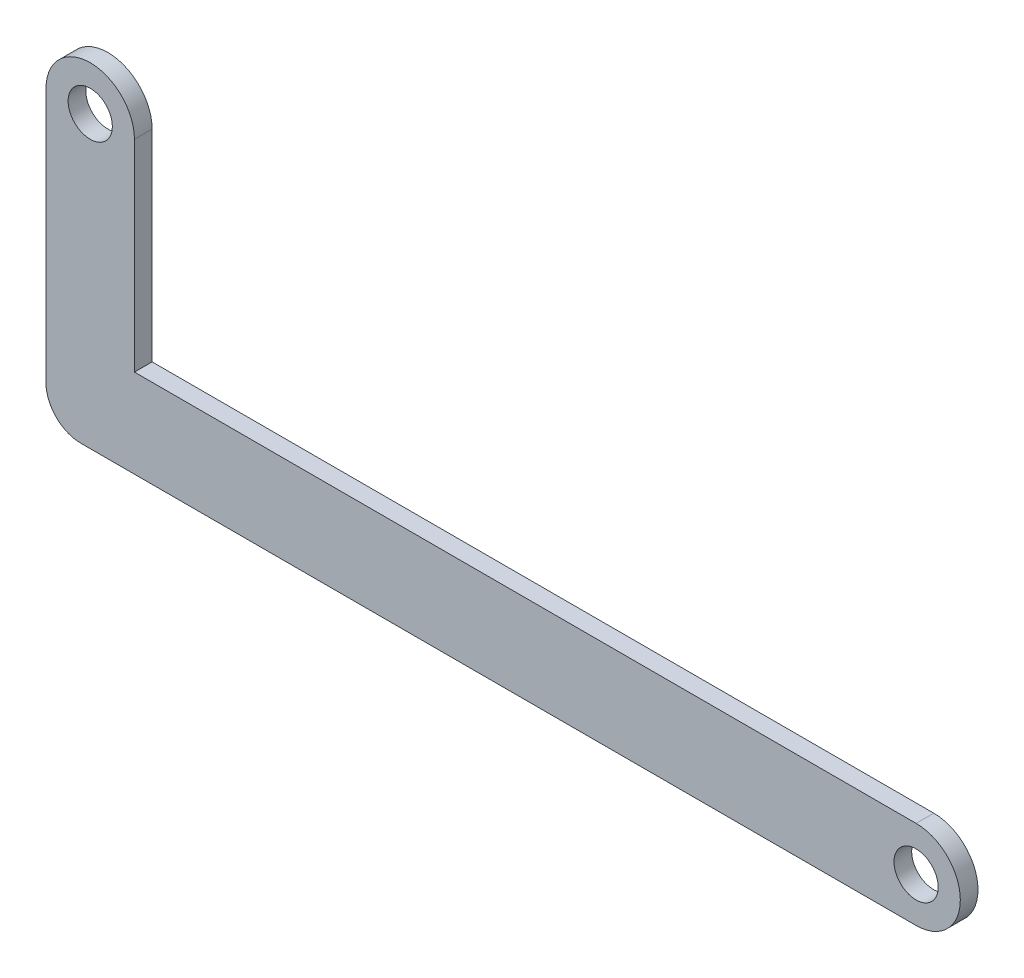
ISO-10303-21;
HEADER;
FILE_DESCRIPTION(('STEP AP214'),'2;1');
FILE_NAME('part.step','',(''),(''),'','','');
FILE_SCHEMA(('AUTOMOTIVE_DESIGN { 1 0 10303 214 1 1 1 1 }'));
ENDSEC;
DATA;
#1=APPLICATION_CONTEXT('core data for automotive mechanical design processes');
#2=APPLICATION_PROTOCOL_DEFINITION('international standard','automotive_design',2000,#1);
#3=PRODUCT_CONTEXT('',#1,'mechanical');
#4=PRODUCT('Part','Part','',(#3));
#5=PRODUCT_RELATED_PRODUCT_CATEGORY('part','',(#4));
#6=PRODUCT_DEFINITION_FORMATION('','',#4);
#7=PRODUCT_DEFINITION_CONTEXT('part definition',#1,'design');
#8=PRODUCT_DEFINITION('design','',#6,#7);
#9=PRODUCT_DEFINITION_SHAPE('','',#8);
#10=(LENGTH_UNIT() NAMED_UNIT(*) SI_UNIT(.MILLI.,.METRE.));
#11=(NAMED_UNIT(*) PLANE_ANGLE_UNIT() SI_UNIT($,.RADIAN.));
#12=(NAMED_UNIT(*) SI_UNIT($,.STERADIAN.) SOLID_ANGLE_UNIT());
#13=UNCERTAINTY_MEASURE_WITH_UNIT(LENGTH_MEASURE(1.E-05),#10,'distance_accuracy_value','');
#14=(GEOMETRIC_REPRESENTATION_CONTEXT(3) GLOBAL_UNCERTAINTY_ASSIGNED_CONTEXT((#13)) GLOBAL_UNIT_ASSIGNED_CONTEXT((#10,
#11,#12)) REPRESENTATION_CONTEXT('',''));
#15=CARTESIAN_POINT('',(0.,0.,0.));
#16=DIRECTION('',(0.,0.,1.));
#17=DIRECTION('',(1.,0.,0.));
#18=AXIS2_PLACEMENT_3D('',#15,#16,#17);
#19=CARTESIAN_POINT('',(0.,0.,-5.08));
#20=DIRECTION('',(0.,0.,1.));
#21=DIRECTION('',(1.,0.,0.));
#22=AXIS2_PLACEMENT_3D('',#19,#20,#21);
#23=PLANE('',#22);
#24=CARTESIAN_POINT('',(0.,0.,-5.08));
#25=DIRECTION('',(0.,0.,-1.));
#26=DIRECTION('',(1.,0.,0.));
#27=AXIS2_PLACEMENT_3D('',#24,#25,#26);
#28=CIRCLE('',#27,12.7);
#29=CARTESIAN_POINT('',(0.,12.7,-5.08));
#30=VERTEX_POINT('',#29);
#31=CARTESIAN_POINT('',(0.,-12.7,-5.08));
#32=VERTEX_POINT('',#31);
#33=EDGE_CURVE('E147',#30,#32,#28,.T.);
#34=ORIENTED_EDGE('',*,*,#33,.T.);
#35=DIRECTION('',(-1.,0.,0.));
#36=VECTOR('',#35,1.);
#37=CARTESIAN_POINT('',(0.,-12.7,-5.08));
#38=LINE('',#37,#36);
#39=CARTESIAN_POINT('',(-239.9,-12.7,-5.08));
#40=VERTEX_POINT('',#39);
#41=EDGE_CURVE('E100',#32,#40,#38,.T.);
#42=ORIENTED_EDGE('',*,*,#41,.T.);
#43=CARTESIAN_POINT('',(-239.9,-2.7,-5.08));
#44=DIRECTION('',(0.,0.,-1.));
#45=DIRECTION('',(-1.,0.,0.));
#46=AXIS2_PLACEMENT_3D('',#43,#44,#45);
#47=CIRCLE('',#46,10.);
#48=CARTESIAN_POINT('',(-249.9,-2.7,-5.08));
#49=VERTEX_POINT('',#48);
#50=EDGE_CURVE('E159',#40,#49,#47,.T.);
#51=ORIENTED_EDGE('',*,*,#50,.T.);
#52=DIRECTION('',(0.,1.,0.));
#53=VECTOR('',#52,1.);
#54=CARTESIAN_POINT('',(-249.9,70.6,-5.08));
#55=LINE('',#54,#53);
#56=CARTESIAN_POINT('',(-249.9,70.6,-5.08));
#57=VERTEX_POINT('',#56);
#58=EDGE_CURVE('E116',#49,#57,#55,.T.);
#59=ORIENTED_EDGE('',*,*,#58,.T.);
#60=CARTESIAN_POINT('',(-237.2,70.6,-5.08));
#61=DIRECTION('',(0.,0.,-1.));
#62=DIRECTION('',(-1.,0.,0.));
#63=AXIS2_PLACEMENT_3D('',#60,#61,#62);
#64=CIRCLE('',#63,12.7);
#65=CARTESIAN_POINT('',(-224.5,70.6,-5.08));
#66=VERTEX_POINT('',#65);
#67=EDGE_CURVE('E110',#57,#66,#64,.T.);
#68=ORIENTED_EDGE('',*,*,#67,.T.);
#69=DIRECTION('',(0.,-1.,0.));
#70=VECTOR('',#69,1.);
#71=CARTESIAN_POINT('',(-224.5,12.7,-5.08));
#72=LINE('',#71,#70);
#73=CARTESIAN_POINT('',(-224.5,12.7,-5.08));
#74=VERTEX_POINT('',#73);
#75=EDGE_CURVE('E114',#66,#74,#72,.T.);
#76=ORIENTED_EDGE('',*,*,#75,.T.);
#77=DIRECTION('',(1.,0.,0.));
#78=VECTOR('',#77,1.);
#79=CARTESIAN_POINT('',(0.,12.7,-5.08));
#80=LINE('',#79,#78);
#81=EDGE_CURVE('E60',#74,#30,#80,.T.);
#82=ORIENTED_EDGE('',*,*,#81,.T.);
#83=EDGE_LOOP('',(#34,#42,#51,#59,#68,#76,#82));
#84=FACE_BOUND('',#83,.T.);
#85=CARTESIAN_POINT('',(0.,0.,-5.08));
#86=DIRECTION('',(0.,0.,-1.));
#87=DIRECTION('',(-1.,0.,0.));
#88=AXIS2_PLACEMENT_3D('',#85,#86,#87);
#89=CIRCLE('',#88,6.35);
#90=CARTESIAN_POINT('',(-6.35,0.,-5.08));
#91=VERTEX_POINT('',#90);
#92=EDGE_CURVE('E138',#91,#91,#89,.T.);
#93=ORIENTED_EDGE('',*,*,#92,.F.);
#94=EDGE_LOOP('',(#93));
#95=FACE_BOUND('',#94,.T.);
#96=CARTESIAN_POINT('',(-237.2,70.6,-5.08));
#97=DIRECTION('',(0.,0.,-1.));
#98=DIRECTION('',(1.,0.,0.));
#99=AXIS2_PLACEMENT_3D('',#96,#97,#98);
#100=CIRCLE('',#99,6.34999999999999);
#101=CARTESIAN_POINT('',(-230.85,70.6,-5.08));
#102=VERTEX_POINT('',#101);
#103=EDGE_CURVE('E174',#102,#102,#100,.T.);
#104=ORIENTED_EDGE('',*,*,#103,.F.);
#105=EDGE_LOOP('',(#104));
#106=FACE_BOUND('',#105,.T.);
#107=ADVANCED_FACE('F43',(#84,#95,#106),#23,.F.);
#108=CARTESIAN_POINT('',(0.,0.,0.));
#109=DIRECTION('',(0.,0.,1.));
#110=DIRECTION('',(1.,0.,0.));
#111=AXIS2_PLACEMENT_3D('',#108,#109,#110);
#112=PLANE('',#111);
#113=CARTESIAN_POINT('',(0.,0.,0.));
#114=DIRECTION('',(0.,0.,-1.));
#115=DIRECTION('',(-1.,0.,0.));
#116=AXIS2_PLACEMENT_3D('',#113,#114,#115);
#117=CIRCLE('',#116,6.35);
#118=CARTESIAN_POINT('',(-6.35,0.,0.));
#119=VERTEX_POINT('',#118);
#120=EDGE_CURVE('E171',#119,#119,#117,.T.);
#121=ORIENTED_EDGE('',*,*,#120,.T.);
#122=EDGE_LOOP('',(#121));
#123=FACE_BOUND('',#122,.T.);
#124=CARTESIAN_POINT('',(0.,0.,0.));
#125=DIRECTION('',(0.,0.,-1.));
#126=DIRECTION('',(1.,0.,0.));
#127=AXIS2_PLACEMENT_3D('',#124,#125,#126);
#128=CIRCLE('',#127,12.7);
#129=CARTESIAN_POINT('',(0.,12.7,0.));
#130=VERTEX_POINT('',#129);
#131=CARTESIAN_POINT('',(0.,-12.7,0.));
#132=VERTEX_POINT('',#131);
#133=EDGE_CURVE('E134',#130,#132,#128,.T.);
#134=ORIENTED_EDGE('',*,*,#133,.F.);
#135=DIRECTION('',(1.,0.,0.));
#136=VECTOR('',#135,1.);
#137=CARTESIAN_POINT('',(0.,12.7,0.));
#138=LINE('',#137,#136);
#139=CARTESIAN_POINT('',(-224.5,12.7,0.));
#140=VERTEX_POINT('',#139);
#141=EDGE_CURVE('E92',#140,#130,#138,.T.);
#142=ORIENTED_EDGE('',*,*,#141,.F.);
#143=DIRECTION('',(0.,-1.,0.));
#144=VECTOR('',#143,1.);
#145=CARTESIAN_POINT('',(-224.5,12.7,0.));
#146=LINE('',#145,#144);
#147=CARTESIAN_POINT('',(-224.5,70.6,0.));
#148=VERTEX_POINT('',#147);
#149=EDGE_CURVE('E86',#148,#140,#146,.T.);
#150=ORIENTED_EDGE('',*,*,#149,.F.);
#151=CARTESIAN_POINT('',(-237.2,70.6,0.));
#152=DIRECTION('',(0.,0.,-1.));
#153=DIRECTION('',(-1.,0.,0.));
#154=AXIS2_PLACEMENT_3D('',#151,#152,#153);
#155=CIRCLE('',#154,12.7);
#156=CARTESIAN_POINT('',(-249.9,70.6,0.));
#157=VERTEX_POINT('',#156);
#158=EDGE_CURVE('E124',#157,#148,#155,.T.);
#159=ORIENTED_EDGE('',*,*,#158,.F.);
#160=DIRECTION('',(0.,1.,0.));
#161=VECTOR('',#160,1.);
#162=CARTESIAN_POINT('',(-249.9,70.6,0.));
#163=LINE('',#162,#161);
#164=CARTESIAN_POINT('',(-249.9,-2.7,0.));
#165=VERTEX_POINT('',#164);
#166=EDGE_CURVE('E142',#165,#157,#163,.T.);
#167=ORIENTED_EDGE('',*,*,#166,.F.);
#168=CARTESIAN_POINT('',(-239.9,-2.7,0.));
#169=DIRECTION('',(0.,0.,-1.));
#170=DIRECTION('',(-1.,0.,0.));
#171=AXIS2_PLACEMENT_3D('',#168,#169,#170);
#172=CIRCLE('',#171,10.);
#173=CARTESIAN_POINT('',(-239.9,-12.7,0.));
#174=VERTEX_POINT('',#173);
#175=EDGE_CURVE('E140',#174,#165,#172,.T.);
#176=ORIENTED_EDGE('',*,*,#175,.F.);
#177=DIRECTION('',(-1.,0.,0.));
#178=VECTOR('',#177,1.);
#179=CARTESIAN_POINT('',(0.,-12.7,0.));
#180=LINE('',#179,#178);
#181=EDGE_CURVE('E137',#132,#174,#180,.T.);
#182=ORIENTED_EDGE('',*,*,#181,.F.);
#183=EDGE_LOOP('',(#134,#142,#150,#159,#167,#176,#182));
#184=FACE_BOUND('',#183,.T.);
#185=CARTESIAN_POINT('',(-237.2,70.6,0.));
#186=DIRECTION('',(0.,0.,-1.));
#187=DIRECTION('',(1.,0.,0.));
#188=AXIS2_PLACEMENT_3D('',#185,#186,#187);
#189=CIRCLE('',#188,6.34999999999999);
#190=CARTESIAN_POINT('',(-230.85,70.6,0.));
#191=VERTEX_POINT('',#190);
#192=EDGE_CURVE('E177',#191,#191,#189,.T.);
#193=ORIENTED_EDGE('',*,*,#192,.T.);
#194=EDGE_LOOP('',(#193));
#195=FACE_BOUND('',#194,.T.);
#196=ADVANCED_FACE('F163',(#123,#184,#195),#112,.T.);
#197=CARTESIAN_POINT('',(0.,0.,-5.08));
#198=DIRECTION('',(0.,0.,1.));
#199=DIRECTION('',(1.,0.,0.));
#200=AXIS2_PLACEMENT_3D('',#197,#198,#199);
#201=CYLINDRICAL_SURFACE('',#200,12.7);
#202=ORIENTED_EDGE('',*,*,#133,.T.);
#203=DIRECTION('',(0.,0.,1.));
#204=VECTOR('',#203,1.);
#205=CARTESIAN_POINT('',(0.,-12.7,-5.08));
#206=LINE('',#205,#204);
#207=EDGE_CURVE('E11',#32,#132,#206,.T.);
#208=ORIENTED_EDGE('',*,*,#207,.F.);
#209=ORIENTED_EDGE('',*,*,#33,.F.);
#210=DIRECTION('',(0.,0.,1.));
#211=VECTOR('',#210,1.);
#212=CARTESIAN_POINT('',(0.,12.7,-5.08));
#213=LINE('',#212,#211);
#214=EDGE_CURVE('E130',#30,#130,#213,.T.);
#215=ORIENTED_EDGE('',*,*,#214,.T.);
#216=EDGE_LOOP('',(#202,#208,#209,#215));
#217=FACE_BOUND('',#216,.T.);
#218=ADVANCED_FACE('F45',(#217),#201,.T.);
#219=CARTESIAN_POINT('',(0.,-12.7,-5.08));
#220=DIRECTION('',(0.,1.,0.));
#221=DIRECTION('',(0.,0.,1.));
#222=AXIS2_PLACEMENT_3D('',#219,#220,#221);
#223=PLANE('',#222);
#224=ORIENTED_EDGE('',*,*,#181,.T.);
#225=DIRECTION('',(0.,0.,1.));
#226=VECTOR('',#225,1.);
#227=CARTESIAN_POINT('',(-239.9,-12.7,-5.08));
#228=LINE('',#227,#226);
#229=EDGE_CURVE('E52',#40,#174,#228,.T.);
#230=ORIENTED_EDGE('',*,*,#229,.F.);
#231=ORIENTED_EDGE('',*,*,#41,.F.);
#232=ORIENTED_EDGE('',*,*,#207,.T.);
#233=EDGE_LOOP('',(#224,#230,#231,#232));
#234=FACE_BOUND('',#233,.T.);
#235=ADVANCED_FACE('F207',(#234),#223,.F.);
#236=CARTESIAN_POINT('',(-239.9,-2.7,-5.08));
#237=DIRECTION('',(0.,0.,1.));
#238=DIRECTION('',(1.,0.,0.));
#239=AXIS2_PLACEMENT_3D('',#236,#237,#238);
#240=CYLINDRICAL_SURFACE('',#239,10.);
#241=ORIENTED_EDGE('',*,*,#175,.T.);
#242=DIRECTION('',(0.,0.,1.));
#243=VECTOR('',#242,1.);
#244=CARTESIAN_POINT('',(-249.9,-2.7,-5.08));
#245=LINE('',#244,#243);
#246=EDGE_CURVE('E151',#49,#165,#245,.T.);
#247=ORIENTED_EDGE('',*,*,#246,.F.);
#248=ORIENTED_EDGE('',*,*,#50,.F.);
#249=ORIENTED_EDGE('',*,*,#229,.T.);
#250=EDGE_LOOP('',(#241,#247,#248,#249));
#251=FACE_BOUND('',#250,.T.);
#252=ADVANCED_FACE('F157',(#251),#240,.T.);
#253=CARTESIAN_POINT('',(-249.9,70.6,-5.08));
#254=DIRECTION('',(1.,0.,0.));
#255=DIRECTION('',(0.,0.,-1.));
#256=AXIS2_PLACEMENT_3D('',#253,#254,#255);
#257=PLANE('',#256);
#258=ORIENTED_EDGE('',*,*,#166,.T.);
#259=DIRECTION('',(0.,0.,1.));
#260=VECTOR('',#259,1.);
#261=CARTESIAN_POINT('',(-249.9,70.6,-5.08));
#262=LINE('',#261,#260);
#263=EDGE_CURVE('E125',#57,#157,#262,.T.);
#264=ORIENTED_EDGE('',*,*,#263,.F.);
#265=ORIENTED_EDGE('',*,*,#58,.F.);
#266=ORIENTED_EDGE('',*,*,#246,.T.);
#267=EDGE_LOOP('',(#258,#264,#265,#266));
#268=FACE_BOUND('',#267,.T.);
#269=ADVANCED_FACE('F166',(#268),#257,.F.);
#270=CARTESIAN_POINT('',(-237.2,70.6,-5.08));
#271=DIRECTION('',(0.,0.,1.));
#272=DIRECTION('',(1.,0.,0.));
#273=AXIS2_PLACEMENT_3D('',#270,#271,#272);
#274=CYLINDRICAL_SURFACE('',#273,12.7);
#275=ORIENTED_EDGE('',*,*,#158,.T.);
#276=DIRECTION('',(0.,0.,1.));
#277=VECTOR('',#276,1.);
#278=CARTESIAN_POINT('',(-224.5,70.6,-5.08));
#279=LINE('',#278,#277);
#280=EDGE_CURVE('E121',#66,#148,#279,.T.);
#281=ORIENTED_EDGE('',*,*,#280,.F.);
#282=ORIENTED_EDGE('',*,*,#67,.F.);
#283=ORIENTED_EDGE('',*,*,#263,.T.);
#284=EDGE_LOOP('',(#275,#281,#282,#283));
#285=FACE_BOUND('',#284,.T.);
#286=ADVANCED_FACE('F122',(#285),#274,.T.);
#287=CARTESIAN_POINT('',(-224.5,12.7,-5.08));
#288=DIRECTION('',(-1.,0.,0.));
#289=DIRECTION('',(0.,0.,1.));
#290=AXIS2_PLACEMENT_3D('',#287,#288,#289);
#291=PLANE('',#290);
#292=ORIENTED_EDGE('',*,*,#149,.T.);
#293=DIRECTION('',(0.,0.,1.));
#294=VECTOR('',#293,1.);
#295=CARTESIAN_POINT('',(-224.5,12.7,-5.08));
#296=LINE('',#295,#294);
#297=EDGE_CURVE('E126',#74,#140,#296,.T.);
#298=ORIENTED_EDGE('',*,*,#297,.F.);
#299=ORIENTED_EDGE('',*,*,#75,.F.);
#300=ORIENTED_EDGE('',*,*,#280,.T.);
#301=EDGE_LOOP('',(#292,#298,#299,#300));
#302=FACE_BOUND('',#301,.T.);
#303=ADVANCED_FACE('F128',(#302),#291,.F.);
#304=CARTESIAN_POINT('',(0.,12.7,-5.08));
#305=DIRECTION('',(0.,-1.,0.));
#306=DIRECTION('',(1.,0.,0.));
#307=AXIS2_PLACEMENT_3D('',#304,#305,#306);
#308=PLANE('',#307);
#309=ORIENTED_EDGE('',*,*,#141,.T.);
#310=ORIENTED_EDGE('',*,*,#214,.F.);
#311=ORIENTED_EDGE('',*,*,#81,.F.);
#312=ORIENTED_EDGE('',*,*,#297,.T.);
#313=EDGE_LOOP('',(#309,#310,#311,#312));
#314=FACE_BOUND('',#313,.T.);
#315=ADVANCED_FACE('F197',(#314),#308,.F.);
#316=CARTESIAN_POINT('',(0.,0.,-5.08));
#317=DIRECTION('',(0.,0.,1.));
#318=DIRECTION('',(1.,0.,0.));
#319=AXIS2_PLACEMENT_3D('',#316,#317,#318);
#320=CYLINDRICAL_SURFACE('',#319,6.35);
#321=ORIENTED_EDGE('',*,*,#92,.T.);
#322=EDGE_LOOP('',(#321));
#323=FACE_BOUND('',#322,.T.);
#324=ORIENTED_EDGE('',*,*,#120,.F.);
#325=EDGE_LOOP('',(#324));
#326=FACE_BOUND('',#325,.T.);
#327=ADVANCED_FACE('F194',(#323,#326),#320,.F.);
#328=CARTESIAN_POINT('',(-237.2,70.6,-5.08));
#329=DIRECTION('',(0.,0.,1.));
#330=DIRECTION('',(1.,0.,0.));
#331=AXIS2_PLACEMENT_3D('',#328,#329,#330);
#332=CYLINDRICAL_SURFACE('',#331,6.34999999999999);
#333=ORIENTED_EDGE('',*,*,#103,.T.);
#334=EDGE_LOOP('',(#333));
#335=FACE_BOUND('',#334,.T.);
#336=ORIENTED_EDGE('',*,*,#192,.F.);
#337=EDGE_LOOP('',(#336));
#338=FACE_BOUND('',#337,.T.);
#339=ADVANCED_FACE('F183',(#335,#338),#332,.F.);
#340=CLOSED_SHELL('',(#107,#196,#218,#235,#252,#269,#286,#303,#315,#327,#339));
#341=MANIFOLD_SOLID_BREP('B2',#340);
#342=ADVANCED_BREP_SHAPE_REPRESENTATION('',(#18,#341),#14);
#343=SHAPE_DEFINITION_REPRESENTATION(#9,#342);
ENDSEC;
END-ISO-10303-21;
